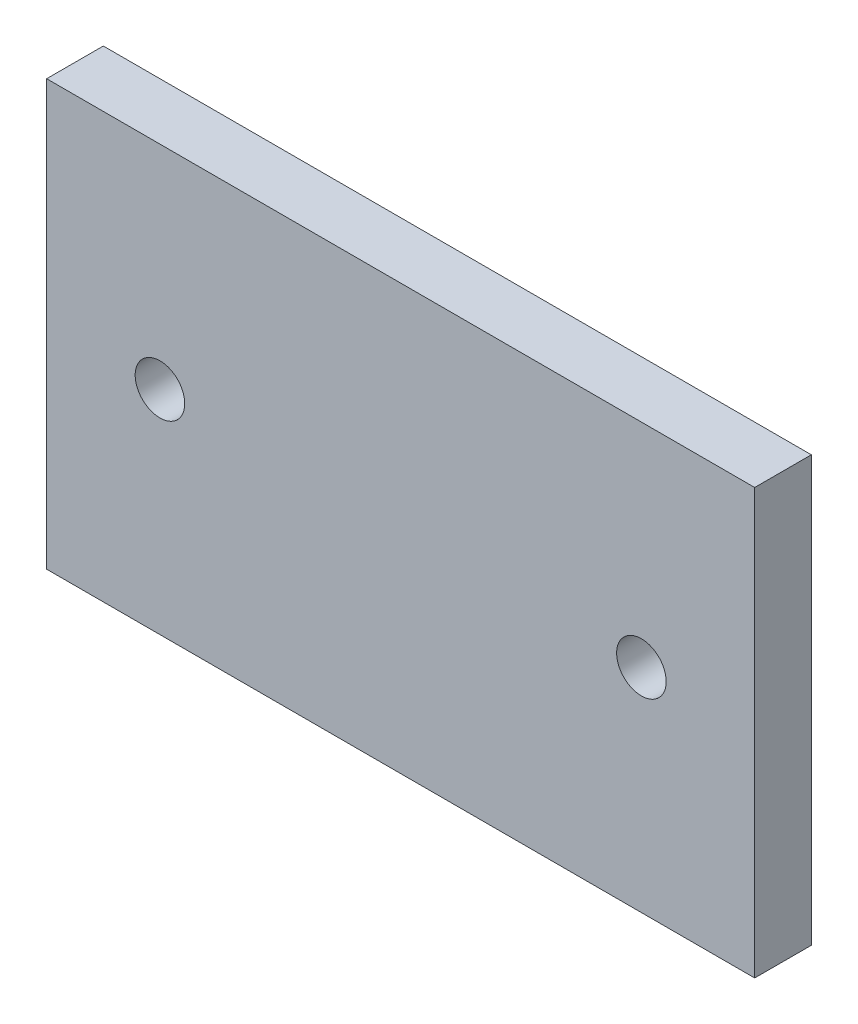
ISO-10303-21;
HEADER;
FILE_DESCRIPTION(('STEP AP214'),'2;1');
FILE_NAME('part.step','',(''),(''),'','','');
FILE_SCHEMA(('AUTOMOTIVE_DESIGN { 1 0 10303 214 1 1 1 1 }'));
ENDSEC;
DATA;
#1=APPLICATION_CONTEXT('core data for automotive mechanical design processes');
#2=APPLICATION_PROTOCOL_DEFINITION('international standard','automotive_design',2000,#1);
#3=PRODUCT_CONTEXT('',#1,'mechanical');
#4=PRODUCT('Part','Part','',(#3));
#5=PRODUCT_RELATED_PRODUCT_CATEGORY('part','',(#4));
#6=PRODUCT_DEFINITION_FORMATION('','',#4);
#7=PRODUCT_DEFINITION_CONTEXT('part definition',#1,'design');
#8=PRODUCT_DEFINITION('design','',#6,#7);
#9=PRODUCT_DEFINITION_SHAPE('','',#8);
#10=(LENGTH_UNIT() NAMED_UNIT(*) SI_UNIT(.MILLI.,.METRE.));
#11=(NAMED_UNIT(*) PLANE_ANGLE_UNIT() SI_UNIT($,.RADIAN.));
#12=(NAMED_UNIT(*) SI_UNIT($,.STERADIAN.) SOLID_ANGLE_UNIT());
#13=UNCERTAINTY_MEASURE_WITH_UNIT(LENGTH_MEASURE(1.E-05),#10,'distance_accuracy_value','');
#14=(GEOMETRIC_REPRESENTATION_CONTEXT(3) GLOBAL_UNCERTAINTY_ASSIGNED_CONTEXT((#13)) GLOBAL_UNIT_ASSIGNED_CONTEXT((#10,
#11,#12)) REPRESENTATION_CONTEXT('',''));
#15=CARTESIAN_POINT('',(0.,0.,0.));
#16=DIRECTION('',(0.,0.,1.));
#17=DIRECTION('',(1.,0.,0.));
#18=AXIS2_PLACEMENT_3D('',#15,#16,#17);
#19=CARTESIAN_POINT('',(100.,60.,16.));
#20=DIRECTION('',(-1.,0.,0.));
#21=DIRECTION('',(0.,0.,1.));
#22=AXIS2_PLACEMENT_3D('',#19,#20,#21);
#23=PLANE('',#22);
#24=DIRECTION('',(0.,1.,0.));
#25=VECTOR('',#24,1.);
#26=CARTESIAN_POINT('',(100.,60.,0.));
#27=LINE('',#26,#25);
#28=CARTESIAN_POINT('',(100.,-60.,0.));
#29=VERTEX_POINT('',#28);
#30=CARTESIAN_POINT('',(100.,60.,0.));
#31=VERTEX_POINT('',#30);
#32=EDGE_CURVE('E99',#29,#31,#27,.T.);
#33=ORIENTED_EDGE('',*,*,#32,.T.);
#34=DIRECTION('',(0.,0.,-1.));
#35=VECTOR('',#34,1.);
#36=CARTESIAN_POINT('',(100.,60.,16.));
#37=LINE('',#36,#35);
#38=CARTESIAN_POINT('',(100.,60.,16.));
#39=VERTEX_POINT('',#38);
#40=EDGE_CURVE('E11',#39,#31,#37,.T.);
#41=ORIENTED_EDGE('',*,*,#40,.F.);
#42=DIRECTION('',(0.,1.,0.));
#43=VECTOR('',#42,1.);
#44=CARTESIAN_POINT('',(100.,60.,16.));
#45=LINE('',#44,#43);
#46=CARTESIAN_POINT('',(100.,-60.,16.));
#47=VERTEX_POINT('',#46);
#48=EDGE_CURVE('E87',#47,#39,#45,.T.);
#49=ORIENTED_EDGE('',*,*,#48,.F.);
#50=DIRECTION('',(0.,0.,-1.));
#51=VECTOR('',#50,1.);
#52=CARTESIAN_POINT('',(100.,-60.,16.));
#53=LINE('',#52,#51);
#54=EDGE_CURVE('E95',#47,#29,#53,.T.);
#55=ORIENTED_EDGE('',*,*,#54,.T.);
#56=EDGE_LOOP('',(#33,#41,#49,#55));
#57=FACE_BOUND('',#56,.T.);
#58=ADVANCED_FACE('F36',(#57),#23,.F.);
#59=CARTESIAN_POINT('',(-100.,60.,16.));
#60=DIRECTION('',(0.,-1.,0.));
#61=DIRECTION('',(0.,0.,-1.));
#62=AXIS2_PLACEMENT_3D('',#59,#60,#61);
#63=PLANE('',#62);
#64=DIRECTION('',(-1.,0.,0.));
#65=VECTOR('',#64,1.);
#66=CARTESIAN_POINT('',(-100.,60.,0.));
#67=LINE('',#66,#65);
#68=CARTESIAN_POINT('',(-100.,60.,0.));
#69=VERTEX_POINT('',#68);
#70=EDGE_CURVE('E91',#31,#69,#67,.T.);
#71=ORIENTED_EDGE('',*,*,#70,.T.);
#72=DIRECTION('',(0.,0.,-1.));
#73=VECTOR('',#72,1.);
#74=CARTESIAN_POINT('',(-100.,60.,16.));
#75=LINE('',#74,#73);
#76=CARTESIAN_POINT('',(-100.,60.,16.));
#77=VERTEX_POINT('',#76);
#78=EDGE_CURVE('E44',#77,#69,#75,.T.);
#79=ORIENTED_EDGE('',*,*,#78,.F.);
#80=DIRECTION('',(-1.,0.,0.));
#81=VECTOR('',#80,1.);
#82=CARTESIAN_POINT('',(-100.,60.,16.));
#83=LINE('',#82,#81);
#84=EDGE_CURVE('E82',#39,#77,#83,.T.);
#85=ORIENTED_EDGE('',*,*,#84,.F.);
#86=ORIENTED_EDGE('',*,*,#40,.T.);
#87=EDGE_LOOP('',(#71,#79,#85,#86));
#88=FACE_BOUND('',#87,.T.);
#89=ADVANCED_FACE('F90',(#88),#63,.F.);
#90=CARTESIAN_POINT('',(-100.,60.,16.));
#91=DIRECTION('',(1.,0.,0.));
#92=DIRECTION('',(0.,0.,-1.));
#93=AXIS2_PLACEMENT_3D('',#90,#91,#92);
#94=PLANE('',#93);
#95=DIRECTION('',(0.,-1.,0.));
#96=VECTOR('',#95,1.);
#97=CARTESIAN_POINT('',(-100.,60.,0.));
#98=LINE('',#97,#96);
#99=CARTESIAN_POINT('',(-100.,-60.,0.));
#100=VERTEX_POINT('',#99);
#101=EDGE_CURVE('E69',#69,#100,#98,.T.);
#102=ORIENTED_EDGE('',*,*,#101,.T.);
#103=DIRECTION('',(0.,0.,-1.));
#104=VECTOR('',#103,1.);
#105=CARTESIAN_POINT('',(-100.,-60.,16.));
#106=LINE('',#105,#104);
#107=CARTESIAN_POINT('',(-100.,-60.,16.));
#108=VERTEX_POINT('',#107);
#109=EDGE_CURVE('E92',#108,#100,#106,.T.);
#110=ORIENTED_EDGE('',*,*,#109,.F.);
#111=DIRECTION('',(0.,-1.,0.));
#112=VECTOR('',#111,1.);
#113=CARTESIAN_POINT('',(-100.,60.,16.));
#114=LINE('',#113,#112);
#115=EDGE_CURVE('E85',#77,#108,#114,.T.);
#116=ORIENTED_EDGE('',*,*,#115,.F.);
#117=ORIENTED_EDGE('',*,*,#78,.T.);
#118=EDGE_LOOP('',(#102,#110,#116,#117));
#119=FACE_BOUND('',#118,.T.);
#120=ADVANCED_FACE('F93',(#119),#94,.F.);
#121=CARTESIAN_POINT('',(-100.,-60.,16.));
#122=DIRECTION('',(0.,1.,0.));
#123=DIRECTION('',(0.,0.,1.));
#124=AXIS2_PLACEMENT_3D('',#121,#122,#123);
#125=PLANE('',#124);
#126=DIRECTION('',(1.,0.,0.));
#127=VECTOR('',#126,1.);
#128=CARTESIAN_POINT('',(-100.,-60.,0.));
#129=LINE('',#128,#127);
#130=EDGE_CURVE('E75',#100,#29,#129,.T.);
#131=ORIENTED_EDGE('',*,*,#130,.T.);
#132=ORIENTED_EDGE('',*,*,#54,.F.);
#133=DIRECTION('',(1.,0.,0.));
#134=VECTOR('',#133,1.);
#135=CARTESIAN_POINT('',(-100.,-60.,16.));
#136=LINE('',#135,#134);
#137=EDGE_CURVE('E52',#108,#47,#136,.T.);
#138=ORIENTED_EDGE('',*,*,#137,.F.);
#139=ORIENTED_EDGE('',*,*,#109,.T.);
#140=EDGE_LOOP('',(#131,#132,#138,#139));
#141=FACE_BOUND('',#140,.T.);
#142=ADVANCED_FACE('F107',(#141),#125,.F.);
#143=CARTESIAN_POINT('',(0.,0.,16.));
#144=DIRECTION('',(0.,0.,1.));
#145=DIRECTION('',(1.,0.,0.));
#146=AXIS2_PLACEMENT_3D('',#143,#144,#145);
#147=PLANE('',#146);
#148=CARTESIAN_POINT('',(68.,0.,16.));
#149=DIRECTION('',(0.,0.,1.));
#150=DIRECTION('',(1.,0.,0.));
#151=AXIS2_PLACEMENT_3D('',#148,#149,#150);
#152=CIRCLE('',#151,7.);
#153=CARTESIAN_POINT('',(75.,0.,16.));
#154=VERTEX_POINT('',#153);
#155=EDGE_CURVE('E119',#154,#154,#152,.T.);
#156=ORIENTED_EDGE('',*,*,#155,.F.);
#157=EDGE_LOOP('',(#156));
#158=FACE_BOUND('',#157,.T.);
#159=CARTESIAN_POINT('',(-68.,0.,16.));
#160=DIRECTION('',(0.,0.,1.));
#161=DIRECTION('',(1.,0.,0.));
#162=AXIS2_PLACEMENT_3D('',#159,#160,#161);
#163=CIRCLE('',#162,7.);
#164=CARTESIAN_POINT('',(-61.,0.,16.));
#165=VERTEX_POINT('',#164);
#166=EDGE_CURVE('E113',#165,#165,#163,.T.);
#167=ORIENTED_EDGE('',*,*,#166,.F.);
#168=EDGE_LOOP('',(#167));
#169=FACE_BOUND('',#168,.T.);
#170=ORIENTED_EDGE('',*,*,#48,.T.);
#171=ORIENTED_EDGE('',*,*,#84,.T.);
#172=ORIENTED_EDGE('',*,*,#115,.T.);
#173=ORIENTED_EDGE('',*,*,#137,.T.);
#174=EDGE_LOOP('',(#170,#171,#172,#173));
#175=FACE_BOUND('',#174,.T.);
#176=ADVANCED_FACE('F83',(#158,#169,#175),#147,.T.);
#177=CARTESIAN_POINT('',(0.,0.,0.));
#178=DIRECTION('',(0.,0.,1.));
#179=DIRECTION('',(1.,0.,0.));
#180=AXIS2_PLACEMENT_3D('',#177,#178,#179);
#181=PLANE('',#180);
#182=CARTESIAN_POINT('',(68.,0.,0.));
#183=DIRECTION('',(0.,0.,1.));
#184=DIRECTION('',(1.,0.,0.));
#185=AXIS2_PLACEMENT_3D('',#182,#183,#184);
#186=CIRCLE('',#185,7.);
#187=CARTESIAN_POINT('',(75.,0.,0.));
#188=VERTEX_POINT('',#187);
#189=EDGE_CURVE('E116',#188,#188,#186,.T.);
#190=ORIENTED_EDGE('',*,*,#189,.T.);
#191=EDGE_LOOP('',(#190));
#192=FACE_BOUND('',#191,.T.);
#193=CARTESIAN_POINT('',(-68.,0.,0.));
#194=DIRECTION('',(0.,0.,1.));
#195=DIRECTION('',(1.,0.,0.));
#196=AXIS2_PLACEMENT_3D('',#193,#194,#195);
#197=CIRCLE('',#196,7.);
#198=CARTESIAN_POINT('',(-61.,0.,0.));
#199=VERTEX_POINT('',#198);
#200=EDGE_CURVE('E102',#199,#199,#197,.T.);
#201=ORIENTED_EDGE('',*,*,#200,.T.);
#202=EDGE_LOOP('',(#201));
#203=FACE_BOUND('',#202,.T.);
#204=ORIENTED_EDGE('',*,*,#32,.F.);
#205=ORIENTED_EDGE('',*,*,#130,.F.);
#206=ORIENTED_EDGE('',*,*,#101,.F.);
#207=ORIENTED_EDGE('',*,*,#70,.F.);
#208=EDGE_LOOP('',(#204,#205,#206,#207));
#209=FACE_BOUND('',#208,.T.);
#210=ADVANCED_FACE('F110',(#192,#203,#209),#181,.F.);
#211=CARTESIAN_POINT('',(-68.,0.,0.));
#212=DIRECTION('',(0.,0.,1.));
#213=DIRECTION('',(1.,0.,0.));
#214=AXIS2_PLACEMENT_3D('',#211,#212,#213);
#215=CYLINDRICAL_SURFACE('',#214,7.);
#216=ORIENTED_EDGE('',*,*,#200,.F.);
#217=EDGE_LOOP('',(#216));
#218=FACE_BOUND('',#217,.T.);
#219=ORIENTED_EDGE('',*,*,#166,.T.);
#220=EDGE_LOOP('',(#219));
#221=FACE_BOUND('',#220,.T.);
#222=ADVANCED_FACE('F130',(#218,#221),#215,.F.);
#223=CARTESIAN_POINT('',(68.,0.,0.));
#224=DIRECTION('',(0.,0.,1.));
#225=DIRECTION('',(1.,0.,0.));
#226=AXIS2_PLACEMENT_3D('',#223,#224,#225);
#227=CYLINDRICAL_SURFACE('',#226,7.);
#228=ORIENTED_EDGE('',*,*,#189,.F.);
#229=EDGE_LOOP('',(#228));
#230=FACE_BOUND('',#229,.T.);
#231=ORIENTED_EDGE('',*,*,#155,.T.);
#232=EDGE_LOOP('',(#231));
#233=FACE_BOUND('',#232,.T.);
#234=ADVANCED_FACE('F127',(#230,#233),#227,.F.);
#235=CLOSED_SHELL('',(#58,#89,#120,#142,#176,#210,#222,#234));
#236=MANIFOLD_SOLID_BREP('B2',#235);
#237=ADVANCED_BREP_SHAPE_REPRESENTATION('',(#18,#236),#14);
#238=SHAPE_DEFINITION_REPRESENTATION(#9,#237);
ENDSEC;
END-ISO-10303-21;
